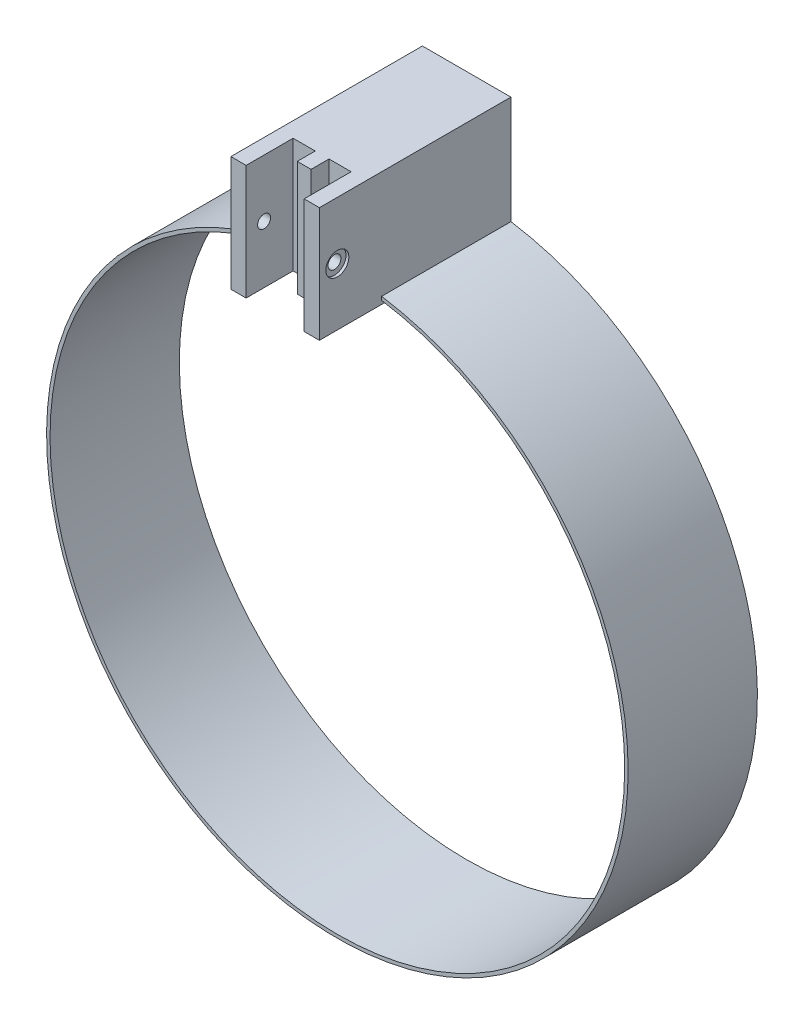
ISO-10303-21;
HEADER;
FILE_DESCRIPTION(('STEP AP214'),'2;1');
FILE_NAME('part.step','',(''),(''),'','','');
FILE_SCHEMA(('AUTOMOTIVE_DESIGN { 1 0 10303 214 1 1 1 1 }'));
ENDSEC;
DATA;
#1=APPLICATION_CONTEXT('core data for automotive mechanical design processes');
#2=APPLICATION_PROTOCOL_DEFINITION('international standard','automotive_design',2000,#1);
#3=PRODUCT_CONTEXT('',#1,'mechanical');
#4=PRODUCT('Part','Part','',(#3));
#5=PRODUCT_RELATED_PRODUCT_CATEGORY('part','',(#4));
#6=PRODUCT_DEFINITION_FORMATION('','',#4);
#7=PRODUCT_DEFINITION_CONTEXT('part definition',#1,'design');
#8=PRODUCT_DEFINITION('design','',#6,#7);
#9=PRODUCT_DEFINITION_SHAPE('','',#8);
#10=(LENGTH_UNIT() NAMED_UNIT(*) SI_UNIT(.MILLI.,.METRE.));
#11=(NAMED_UNIT(*) PLANE_ANGLE_UNIT() SI_UNIT($,.RADIAN.));
#12=(NAMED_UNIT(*) SI_UNIT($,.STERADIAN.) SOLID_ANGLE_UNIT());
#13=UNCERTAINTY_MEASURE_WITH_UNIT(LENGTH_MEASURE(1.E-05),#10,'distance_accuracy_value','');
#14=(GEOMETRIC_REPRESENTATION_CONTEXT(3) GLOBAL_UNCERTAINTY_ASSIGNED_CONTEXT((#13)) GLOBAL_UNIT_ASSIGNED_CONTEXT((#10,
#11,#12)) REPRESENTATION_CONTEXT('',''));
#15=CARTESIAN_POINT('',(0.,0.,0.));
#16=DIRECTION('',(0.,0.,1.));
#17=DIRECTION('',(1.,0.,0.));
#18=AXIS2_PLACEMENT_3D('',#15,#16,#17);
#19=CARTESIAN_POINT('',(-15.4,20.,-15.4));
#20=DIRECTION('',(1.,0.,0.));
#21=DIRECTION('',(0.,0.,-1.));
#22=AXIS2_PLACEMENT_3D('',#19,#20,#21);
#23=PLANE('',#22);
#24=DIRECTION('',(0.,0.,1.));
#25=VECTOR('',#24,1.);
#26=CARTESIAN_POINT('',(-15.4,-20.,-15.4));
#27=LINE('',#26,#25);
#28=CARTESIAN_POINT('',(-15.4,-20.,-60.4));
#29=VERTEX_POINT('',#28);
#30=CARTESIAN_POINT('',(-15.4,-20.,6.25));
#31=VERTEX_POINT('',#30);
#32=EDGE_CURVE('E252',#29,#31,#27,.T.);
#33=ORIENTED_EDGE('',*,*,#32,.T.);
#34=DIRECTION('',(0.,-1.,0.));
#35=VECTOR('',#34,1.);
#36=CARTESIAN_POINT('',(-15.4,20.,6.25));
#37=LINE('',#36,#35);
#38=CARTESIAN_POINT('',(-15.4,20.,6.25));
#39=VERTEX_POINT('',#38);
#40=EDGE_CURVE('E158',#39,#31,#37,.T.);
#41=ORIENTED_EDGE('',*,*,#40,.F.);
#42=DIRECTION('',(0.,0.,1.));
#43=VECTOR('',#42,1.);
#44=CARTESIAN_POINT('',(-15.4,20.,-15.4));
#45=LINE('',#44,#43);
#46=CARTESIAN_POINT('',(-15.4,20.,-60.4));
#47=VERTEX_POINT('',#46);
#48=EDGE_CURVE('E152',#47,#39,#45,.T.);
#49=ORIENTED_EDGE('',*,*,#48,.F.);
#50=DIRECTION('',(0.,-1.,0.));
#51=VECTOR('',#50,1.);
#52=CARTESIAN_POINT('',(-15.4,20.,-60.4));
#53=LINE('',#52,#51);
#54=CARTESIAN_POINT('',(-15.4,-17.5451029129531,-60.4));
#55=VERTEX_POINT('',#54);
#56=EDGE_CURVE('E155',#47,#55,#53,.T.);
#57=ORIENTED_EDGE('',*,*,#56,.T.);
#58=DIRECTION('',(0.,0.,1.));
#59=VECTOR('',#58,1.);
#60=CARTESIAN_POINT('',(-15.4,-17.5451029129531,-60.4));
#61=LINE('',#60,#59);
#62=CARTESIAN_POINT('',(-15.4,-17.5451029129531,-15.4));
#63=VERTEX_POINT('',#62);
#64=EDGE_CURVE('E185',#63,#55,#61,.F.);
#65=ORIENTED_EDGE('',*,*,#64,.F.);
#66=DIRECTION('',(0.,-1.,0.));
#67=VECTOR('',#66,1.);
#68=CARTESIAN_POINT('',(-15.4,20.,-15.4));
#69=LINE('',#68,#67);
#70=CARTESIAN_POINT('',(-15.4,-18.7594158574178,-15.4));
#71=VERTEX_POINT('',#70);
#72=EDGE_CURVE('E260',#63,#71,#69,.T.);
#73=ORIENTED_EDGE('',*,*,#72,.T.);
#74=DIRECTION('',(0.,0.,1.));
#75=VECTOR('',#74,1.);
#76=CARTESIAN_POINT('',(-15.4,-18.7594158574178,-60.4));
#77=LINE('',#76,#75);
#78=CARTESIAN_POINT('',(-15.4,-18.7594158574178,-60.4));
#79=VERTEX_POINT('',#78);
#80=EDGE_CURVE('E12',#71,#79,#77,.F.);
#81=ORIENTED_EDGE('',*,*,#80,.T.);
#82=EDGE_CURVE('E172',#79,#29,#53,.T.);
#83=ORIENTED_EDGE('',*,*,#82,.T.);
#84=EDGE_LOOP('',(#33,#41,#49,#57,#65,#73,#81,#83));
#85=FACE_BOUND('',#84,.T.);
#86=CARTESIAN_POINT('',(-15.4,0.,0.));
#87=DIRECTION('',(-1.,0.,0.));
#88=DIRECTION('',(0.,0.,1.));
#89=AXIS2_PLACEMENT_3D('',#86,#87,#88);
#90=CIRCLE('',#89,3.99999999999999);
#91=CARTESIAN_POINT('',(-15.4,0.,3.99999999999999));
#92=VERTEX_POINT('',#91);
#93=EDGE_CURVE('E196',#92,#92,#90,.T.);
#94=ORIENTED_EDGE('',*,*,#93,.F.);
#95=EDGE_LOOP('',(#94));
#96=FACE_BOUND('',#95,.T.);
#97=ADVANCED_FACE('F39',(#85,#96),#23,.F.);
#98=CARTESIAN_POINT('',(15.4,20.,-15.4));
#99=DIRECTION('',(-1.,0.,0.));
#100=DIRECTION('',(0.,0.,1.));
#101=AXIS2_PLACEMENT_3D('',#98,#99,#100);
#102=PLANE('',#101);
#103=DIRECTION('',(0.,0.,-1.));
#104=VECTOR('',#103,1.);
#105=CARTESIAN_POINT('',(15.4,-20.,-15.4));
#106=LINE('',#105,#104);
#107=CARTESIAN_POINT('',(15.4,-20.,6.25));
#108=VERTEX_POINT('',#107);
#109=CARTESIAN_POINT('',(15.4,-20.,-60.4));
#110=VERTEX_POINT('',#109);
#111=EDGE_CURVE('E250',#108,#110,#106,.T.);
#112=ORIENTED_EDGE('',*,*,#111,.T.);
#113=DIRECTION('',(0.,-1.,0.));
#114=VECTOR('',#113,1.);
#115=CARTESIAN_POINT('',(15.4,20.,-60.4));
#116=LINE('',#115,#114);
#117=CARTESIAN_POINT('',(15.4,-18.7594158574178,-60.4));
#118=VERTEX_POINT('',#117);
#119=EDGE_CURVE('E171',#118,#110,#116,.T.);
#120=ORIENTED_EDGE('',*,*,#119,.F.);
#121=DIRECTION('',(0.,0.,1.));
#122=VECTOR('',#121,1.);
#123=CARTESIAN_POINT('',(15.4,-18.7594158574178,-60.4));
#124=LINE('',#123,#122);
#125=CARTESIAN_POINT('',(15.4,-18.7594158574178,-15.4));
#126=VERTEX_POINT('',#125);
#127=EDGE_CURVE('E47',#118,#126,#124,.T.);
#128=ORIENTED_EDGE('',*,*,#127,.T.);
#129=DIRECTION('',(0.,-1.,0.));
#130=VECTOR('',#129,1.);
#131=CARTESIAN_POINT('',(15.4,20.,-15.4));
#132=LINE('',#131,#130);
#133=CARTESIAN_POINT('',(15.4,-17.5451029129531,-15.4));
#134=VERTEX_POINT('',#133);
#135=EDGE_CURVE('E263',#134,#126,#132,.T.);
#136=ORIENTED_EDGE('',*,*,#135,.F.);
#137=DIRECTION('',(0.,0.,1.));
#138=VECTOR('',#137,1.);
#139=CARTESIAN_POINT('',(15.4,-17.5451029129531,-60.4));
#140=LINE('',#139,#138);
#141=CARTESIAN_POINT('',(15.4,-17.5451029129531,-60.4));
#142=VERTEX_POINT('',#141);
#143=EDGE_CURVE('E182',#142,#134,#140,.T.);
#144=ORIENTED_EDGE('',*,*,#143,.F.);
#145=CARTESIAN_POINT('',(15.4,20.,-60.4));
#146=VERTEX_POINT('',#145);
#147=EDGE_CURVE('E54',#146,#142,#116,.T.);
#148=ORIENTED_EDGE('',*,*,#147,.F.);
#149=DIRECTION('',(0.,0.,-1.));
#150=VECTOR('',#149,1.);
#151=CARTESIAN_POINT('',(15.4,20.,-15.4));
#152=LINE('',#151,#150);
#153=CARTESIAN_POINT('',(15.4,20.,6.25));
#154=VERTEX_POINT('',#153);
#155=EDGE_CURVE('E164',#154,#146,#152,.T.);
#156=ORIENTED_EDGE('',*,*,#155,.F.);
#157=DIRECTION('',(0.,-1.,0.));
#158=VECTOR('',#157,1.);
#159=CARTESIAN_POINT('',(15.4,20.,6.25));
#160=LINE('',#159,#158);
#161=EDGE_CURVE('E266',#154,#108,#160,.T.);
#162=ORIENTED_EDGE('',*,*,#161,.T.);
#163=EDGE_LOOP('',(#112,#120,#128,#136,#144,#148,#156,#162));
#164=FACE_BOUND('',#163,.T.);
#165=CARTESIAN_POINT('',(15.4,0.,0.));
#166=DIRECTION('',(1.,0.,0.));
#167=DIRECTION('',(0.,0.,-1.));
#168=AXIS2_PLACEMENT_3D('',#165,#166,#167);
#169=CIRCLE('',#168,3.99999999999999);
#170=CARTESIAN_POINT('',(15.4,0.,-3.99999999999999));
#171=VERTEX_POINT('',#170);
#172=EDGE_CURVE('E206',#171,#171,#169,.T.);
#173=ORIENTED_EDGE('',*,*,#172,.F.);
#174=EDGE_LOOP('',(#173));
#175=FACE_BOUND('',#174,.T.);
#176=ADVANCED_FACE('F297',(#164,#175),#102,.F.);
#177=CARTESIAN_POINT('',(-10.1,20.,-10.1));
#178=DIRECTION('',(0.,0.,-1.));
#179=DIRECTION('',(-1.,0.,0.));
#180=AXIS2_PLACEMENT_3D('',#177,#178,#179);
#181=PLANE('',#180);
#182=DIRECTION('',(1.,0.,0.));
#183=VECTOR('',#182,1.);
#184=CARTESIAN_POINT('',(-10.1,-20.,-10.1));
#185=LINE('',#184,#183);
#186=CARTESIAN_POINT('',(-10.1,-20.,-10.1));
#187=VERTEX_POINT('',#186);
#188=CARTESIAN_POINT('',(-2.4,-20.,-10.1));
#189=VERTEX_POINT('',#188);
#190=EDGE_CURVE('E215',#187,#189,#185,.T.);
#191=ORIENTED_EDGE('',*,*,#190,.T.);
#192=DIRECTION('',(0.,-1.,0.));
#193=VECTOR('',#192,1.);
#194=CARTESIAN_POINT('',(-2.4,20.,-10.1));
#195=LINE('',#194,#193);
#196=CARTESIAN_POINT('',(-2.4,20.,-10.1));
#197=VERTEX_POINT('',#196);
#198=EDGE_CURVE('E284',#197,#189,#195,.T.);
#199=ORIENTED_EDGE('',*,*,#198,.F.);
#200=DIRECTION('',(1.,0.,0.));
#201=VECTOR('',#200,1.);
#202=CARTESIAN_POINT('',(-10.1,20.,-10.1));
#203=LINE('',#202,#201);
#204=CARTESIAN_POINT('',(-10.1,20.,-10.1));
#205=VERTEX_POINT('',#204);
#206=EDGE_CURVE('E218',#205,#197,#203,.T.);
#207=ORIENTED_EDGE('',*,*,#206,.F.);
#208=DIRECTION('',(0.,-1.,0.));
#209=VECTOR('',#208,1.);
#210=CARTESIAN_POINT('',(-10.1,20.,-10.1));
#211=LINE('',#210,#209);
#212=EDGE_CURVE('E287',#205,#187,#211,.T.);
#213=ORIENTED_EDGE('',*,*,#212,.T.);
#214=EDGE_LOOP('',(#191,#199,#207,#213));
#215=FACE_BOUND('',#214,.T.);
#216=ADVANCED_FACE('F41',(#215),#181,.F.);
#217=CARTESIAN_POINT('',(-2.4,20.,-10.1));
#218=DIRECTION('',(1.,0.,0.));
#219=DIRECTION('',(0.,0.,-1.));
#220=AXIS2_PLACEMENT_3D('',#217,#218,#219);
#221=PLANE('',#220);
#222=DIRECTION('',(0.,0.,1.));
#223=VECTOR('',#222,1.);
#224=CARTESIAN_POINT('',(-2.4,-20.,-10.1));
#225=LINE('',#224,#223);
#226=CARTESIAN_POINT('',(-2.4,-20.,-3.85));
#227=VERTEX_POINT('',#226);
#228=EDGE_CURVE('E237',#189,#227,#225,.T.);
#229=ORIENTED_EDGE('',*,*,#228,.T.);
#230=DIRECTION('',(0.,-1.,0.));
#231=VECTOR('',#230,1.);
#232=CARTESIAN_POINT('',(-2.4,20.,-3.85));
#233=LINE('',#232,#231);
#234=CARTESIAN_POINT('',(-2.4,20.,-3.85));
#235=VERTEX_POINT('',#234);
#236=EDGE_CURVE('E281',#235,#227,#233,.T.);
#237=ORIENTED_EDGE('',*,*,#236,.F.);
#238=DIRECTION('',(0.,0.,1.));
#239=VECTOR('',#238,1.);
#240=CARTESIAN_POINT('',(-2.4,20.,-10.1));
#241=LINE('',#240,#239);
#242=EDGE_CURVE('E221',#197,#235,#241,.T.);
#243=ORIENTED_EDGE('',*,*,#242,.F.);
#244=ORIENTED_EDGE('',*,*,#198,.T.);
#245=EDGE_LOOP('',(#229,#237,#243,#244));
#246=FACE_BOUND('',#245,.T.);
#247=ADVANCED_FACE('F335',(#246),#221,.F.);
#248=CARTESIAN_POINT('',(-2.4,20.,-3.85));
#249=DIRECTION('',(0.,0.,-1.));
#250=DIRECTION('',(-1.,0.,0.));
#251=AXIS2_PLACEMENT_3D('',#248,#249,#250);
#252=PLANE('',#251);
#253=DIRECTION('',(1.,0.,0.));
#254=VECTOR('',#253,1.);
#255=CARTESIAN_POINT('',(-2.4,-20.,-3.85));
#256=LINE('',#255,#254);
#257=CARTESIAN_POINT('',(2.4,-20.,-3.85));
#258=VERTEX_POINT('',#257);
#259=EDGE_CURVE('E239',#227,#258,#256,.T.);
#260=ORIENTED_EDGE('',*,*,#259,.T.);
#261=DIRECTION('',(0.,-1.,0.));
#262=VECTOR('',#261,1.);
#263=CARTESIAN_POINT('',(2.4,20.,-3.85));
#264=LINE('',#263,#262);
#265=CARTESIAN_POINT('',(2.4,20.,-3.85));
#266=VERTEX_POINT('',#265);
#267=EDGE_CURVE('E278',#266,#258,#264,.T.);
#268=ORIENTED_EDGE('',*,*,#267,.F.);
#269=DIRECTION('',(1.,0.,0.));
#270=VECTOR('',#269,1.);
#271=CARTESIAN_POINT('',(-2.4,20.,-3.85));
#272=LINE('',#271,#270);
#273=EDGE_CURVE('E223',#235,#266,#272,.T.);
#274=ORIENTED_EDGE('',*,*,#273,.F.);
#275=ORIENTED_EDGE('',*,*,#236,.T.);
#276=EDGE_LOOP('',(#260,#268,#274,#275));
#277=FACE_BOUND('',#276,.T.);
#278=ADVANCED_FACE('F338',(#277),#252,.F.);
#279=CARTESIAN_POINT('',(2.4,20.,-10.1));
#280=DIRECTION('',(-1.,0.,0.));
#281=DIRECTION('',(0.,0.,1.));
#282=AXIS2_PLACEMENT_3D('',#279,#280,#281);
#283=PLANE('',#282);
#284=DIRECTION('',(0.,0.,-1.));
#285=VECTOR('',#284,1.);
#286=CARTESIAN_POINT('',(2.4,-20.,-10.1));
#287=LINE('',#286,#285);
#288=CARTESIAN_POINT('',(2.4,-20.,-10.1));
#289=VERTEX_POINT('',#288);
#290=EDGE_CURVE('E241',#258,#289,#287,.T.);
#291=ORIENTED_EDGE('',*,*,#290,.T.);
#292=DIRECTION('',(0.,-1.,0.));
#293=VECTOR('',#292,1.);
#294=CARTESIAN_POINT('',(2.4,20.,-10.1));
#295=LINE('',#294,#293);
#296=CARTESIAN_POINT('',(2.4,20.,-10.1));
#297=VERTEX_POINT('',#296);
#298=EDGE_CURVE('E275',#297,#289,#295,.T.);
#299=ORIENTED_EDGE('',*,*,#298,.F.);
#300=DIRECTION('',(0.,0.,-1.));
#301=VECTOR('',#300,1.);
#302=CARTESIAN_POINT('',(2.4,20.,-10.1));
#303=LINE('',#302,#301);
#304=EDGE_CURVE('E225',#266,#297,#303,.T.);
#305=ORIENTED_EDGE('',*,*,#304,.F.);
#306=ORIENTED_EDGE('',*,*,#267,.T.);
#307=EDGE_LOOP('',(#291,#299,#305,#306));
#308=FACE_BOUND('',#307,.T.);
#309=ADVANCED_FACE('F343',(#308),#283,.F.);
#310=CARTESIAN_POINT('',(10.1,20.,-10.1));
#311=DIRECTION('',(0.,0.,-1.));
#312=DIRECTION('',(-1.,0.,0.));
#313=AXIS2_PLACEMENT_3D('',#310,#311,#312);
#314=PLANE('',#313);
#315=DIRECTION('',(1.,0.,0.));
#316=VECTOR('',#315,1.);
#317=CARTESIAN_POINT('',(10.1,-20.,-10.1));
#318=LINE('',#317,#316);
#319=CARTESIAN_POINT('',(10.1,-20.,-10.1));
#320=VERTEX_POINT('',#319);
#321=EDGE_CURVE('E243',#289,#320,#318,.T.);
#322=ORIENTED_EDGE('',*,*,#321,.T.);
#323=DIRECTION('',(0.,-1.,0.));
#324=VECTOR('',#323,1.);
#325=CARTESIAN_POINT('',(10.1,20.,-10.1));
#326=LINE('',#325,#324);
#327=CARTESIAN_POINT('',(10.1,20.,-10.1));
#328=VERTEX_POINT('',#327);
#329=EDGE_CURVE('E272',#328,#320,#326,.T.);
#330=ORIENTED_EDGE('',*,*,#329,.F.);
#331=DIRECTION('',(1.,0.,0.));
#332=VECTOR('',#331,1.);
#333=CARTESIAN_POINT('',(10.1,20.,-10.1));
#334=LINE('',#333,#332);
#335=EDGE_CURVE('E227',#297,#328,#334,.T.);
#336=ORIENTED_EDGE('',*,*,#335,.F.);
#337=ORIENTED_EDGE('',*,*,#298,.T.);
#338=EDGE_LOOP('',(#322,#330,#336,#337));
#339=FACE_BOUND('',#338,.T.);
#340=ADVANCED_FACE('F349',(#339),#314,.F.);
#341=CARTESIAN_POINT('',(10.1,20.,2.4));
#342=DIRECTION('',(1.,0.,0.));
#343=DIRECTION('',(0.,0.,-1.));
#344=AXIS2_PLACEMENT_3D('',#341,#342,#343);
#345=PLANE('',#344);
#346=DIRECTION('',(0.,-1.,0.));
#347=VECTOR('',#346,1.);
#348=CARTESIAN_POINT('',(10.1,20.,6.25));
#349=LINE('',#348,#347);
#350=CARTESIAN_POINT('',(10.1,20.,6.25));
#351=VERTEX_POINT('',#350);
#352=CARTESIAN_POINT('',(10.1,-20.,6.25));
#353=VERTEX_POINT('',#352);
#354=EDGE_CURVE('E269',#351,#353,#349,.T.);
#355=ORIENTED_EDGE('',*,*,#354,.F.);
#356=DIRECTION('',(0.,0.,1.));
#357=VECTOR('',#356,1.);
#358=CARTESIAN_POINT('',(10.1,20.,-2.4));
#359=LINE('',#358,#357);
#360=EDGE_CURVE('E229',#328,#351,#359,.T.);
#361=ORIENTED_EDGE('',*,*,#360,.F.);
#362=ORIENTED_EDGE('',*,*,#329,.T.);
#363=DIRECTION('',(0.,0.,1.));
#364=VECTOR('',#363,1.);
#365=CARTESIAN_POINT('',(10.1,-20.,2.4));
#366=LINE('',#365,#364);
#367=EDGE_CURVE('E246',#320,#353,#366,.T.);
#368=ORIENTED_EDGE('',*,*,#367,.T.);
#369=EDGE_LOOP('',(#355,#361,#362,#368));
#370=FACE_BOUND('',#369,.T.);
#371=CARTESIAN_POINT('',(10.1,0.,0.));
#372=DIRECTION('',(1.,0.,0.));
#373=DIRECTION('',(0.,0.,-1.));
#374=AXIS2_PLACEMENT_3D('',#371,#372,#373);
#375=CIRCLE('',#374,2.25000000000001);
#376=CARTESIAN_POINT('',(10.1,0.,-2.25000000000001));
#377=VERTEX_POINT('',#376);
#378=EDGE_CURVE('E200',#377,#377,#375,.F.);
#379=ORIENTED_EDGE('',*,*,#378,.F.);
#380=EDGE_LOOP('',(#379));
#381=FACE_BOUND('',#380,.T.);
#382=ADVANCED_FACE('F352',(#370,#381),#345,.F.);
#383=CARTESIAN_POINT('',(10.1,20.,6.25));
#384=DIRECTION('',(0.,0.,-1.));
#385=DIRECTION('',(-1.,0.,0.));
#386=AXIS2_PLACEMENT_3D('',#383,#384,#385);
#387=PLANE('',#386);
#388=DIRECTION('',(1.,0.,0.));
#389=VECTOR('',#388,1.);
#390=CARTESIAN_POINT('',(10.1,-20.,6.25));
#391=LINE('',#390,#389);
#392=EDGE_CURVE('E248',#353,#108,#391,.T.);
#393=ORIENTED_EDGE('',*,*,#392,.T.);
#394=ORIENTED_EDGE('',*,*,#161,.F.);
#395=DIRECTION('',(1.,0.,0.));
#396=VECTOR('',#395,1.);
#397=CARTESIAN_POINT('',(10.1,20.,6.25));
#398=LINE('',#397,#396);
#399=EDGE_CURVE('E231',#351,#154,#398,.T.);
#400=ORIENTED_EDGE('',*,*,#399,.F.);
#401=ORIENTED_EDGE('',*,*,#354,.T.);
#402=EDGE_LOOP('',(#393,#394,#400,#401));
#403=FACE_BOUND('',#402,.T.);
#404=ADVANCED_FACE('F354',(#403),#387,.F.);
#405=CARTESIAN_POINT('',(-10.1,20.,6.25));
#406=DIRECTION('',(0.,0.,-1.));
#407=DIRECTION('',(-1.,0.,0.));
#408=AXIS2_PLACEMENT_3D('',#405,#406,#407);
#409=PLANE('',#408);
#410=DIRECTION('',(1.,0.,0.));
#411=VECTOR('',#410,1.);
#412=CARTESIAN_POINT('',(-10.1,-20.,6.25));
#413=LINE('',#412,#411);
#414=CARTESIAN_POINT('',(-10.1,-20.,6.25));
#415=VERTEX_POINT('',#414);
#416=EDGE_CURVE('E254',#31,#415,#413,.T.);
#417=ORIENTED_EDGE('',*,*,#416,.T.);
#418=DIRECTION('',(0.,-1.,0.));
#419=VECTOR('',#418,1.);
#420=CARTESIAN_POINT('',(-10.1,20.,6.25));
#421=LINE('',#420,#419);
#422=CARTESIAN_POINT('',(-10.1,20.,6.25));
#423=VERTEX_POINT('',#422);
#424=EDGE_CURVE('E235',#423,#415,#421,.T.);
#425=ORIENTED_EDGE('',*,*,#424,.F.);
#426=DIRECTION('',(1.,0.,0.));
#427=VECTOR('',#426,1.);
#428=CARTESIAN_POINT('',(-10.1,20.,6.25));
#429=LINE('',#428,#427);
#430=EDGE_CURVE('E163',#39,#423,#429,.T.);
#431=ORIENTED_EDGE('',*,*,#430,.F.);
#432=ORIENTED_EDGE('',*,*,#40,.T.);
#433=EDGE_LOOP('',(#417,#425,#431,#432));
#434=FACE_BOUND('',#433,.T.);
#435=ADVANCED_FACE('F318',(#434),#409,.F.);
#436=CARTESIAN_POINT('',(-10.1,20.,2.4));
#437=DIRECTION('',(-1.,0.,0.));
#438=DIRECTION('',(0.,0.,1.));
#439=AXIS2_PLACEMENT_3D('',#436,#437,#438);
#440=PLANE('',#439);
#441=DIRECTION('',(0.,0.,-1.));
#442=VECTOR('',#441,1.);
#443=CARTESIAN_POINT('',(-10.1,-20.,2.4));
#444=LINE('',#443,#442);
#445=EDGE_CURVE('E219',#415,#187,#444,.T.);
#446=ORIENTED_EDGE('',*,*,#445,.T.);
#447=ORIENTED_EDGE('',*,*,#212,.F.);
#448=DIRECTION('',(0.,0.,-1.));
#449=VECTOR('',#448,1.);
#450=CARTESIAN_POINT('',(-10.1,20.,-2.4));
#451=LINE('',#450,#449);
#452=EDGE_CURVE('E216',#423,#205,#451,.T.);
#453=ORIENTED_EDGE('',*,*,#452,.F.);
#454=ORIENTED_EDGE('',*,*,#424,.T.);
#455=EDGE_LOOP('',(#446,#447,#453,#454));
#456=FACE_BOUND('',#455,.T.);
#457=CARTESIAN_POINT('',(-10.1,0.,0.));
#458=DIRECTION('',(-1.,0.,0.));
#459=DIRECTION('',(0.,0.,1.));
#460=AXIS2_PLACEMENT_3D('',#457,#458,#459);
#461=CIRCLE('',#460,2.25000000000001);
#462=CARTESIAN_POINT('',(-10.1,0.,2.25000000000001));
#463=VERTEX_POINT('',#462);
#464=EDGE_CURVE('E193',#463,#463,#461,.F.);
#465=ORIENTED_EDGE('',*,*,#464,.F.);
#466=EDGE_LOOP('',(#465));
#467=FACE_BOUND('',#466,.T.);
#468=ADVANCED_FACE('F325',(#456,#467),#440,.F.);
#469=CARTESIAN_POINT('',(0.,20.,0.));
#470=DIRECTION('',(0.,1.,0.));
#471=DIRECTION('',(0.,0.,1.));
#472=AXIS2_PLACEMENT_3D('',#469,#470,#471);
#473=PLANE('',#472);
#474=ORIENTED_EDGE('',*,*,#360,.T.);
#475=ORIENTED_EDGE('',*,*,#399,.T.);
#476=ORIENTED_EDGE('',*,*,#155,.T.);
#477=DIRECTION('',(1.,0.,0.));
#478=VECTOR('',#477,1.);
#479=CARTESIAN_POINT('',(-15.4,20.,-60.4));
#480=LINE('',#479,#478);
#481=EDGE_CURVE('E168',#47,#146,#480,.T.);
#482=ORIENTED_EDGE('',*,*,#481,.F.);
#483=ORIENTED_EDGE('',*,*,#48,.T.);
#484=ORIENTED_EDGE('',*,*,#430,.T.);
#485=ORIENTED_EDGE('',*,*,#452,.T.);
#486=ORIENTED_EDGE('',*,*,#206,.T.);
#487=ORIENTED_EDGE('',*,*,#242,.T.);
#488=ORIENTED_EDGE('',*,*,#273,.T.);
#489=ORIENTED_EDGE('',*,*,#304,.T.);
#490=ORIENTED_EDGE('',*,*,#335,.T.);
#491=EDGE_LOOP('',(#474,#475,#476,#482,#483,#484,#485,#486,#487,#488,#489,#490));
#492=FACE_BOUND('',#491,.T.);
#493=ADVANCED_FACE('F174',(#492),#473,.T.);
#494=CARTESIAN_POINT('',(0.,-20.,0.));
#495=DIRECTION('',(0.,1.,0.));
#496=DIRECTION('',(0.,0.,1.));
#497=AXIS2_PLACEMENT_3D('',#494,#495,#496);
#498=PLANE('',#497);
#499=ORIENTED_EDGE('',*,*,#367,.F.);
#500=ORIENTED_EDGE('',*,*,#321,.F.);
#501=ORIENTED_EDGE('',*,*,#290,.F.);
#502=ORIENTED_EDGE('',*,*,#259,.F.);
#503=ORIENTED_EDGE('',*,*,#228,.F.);
#504=ORIENTED_EDGE('',*,*,#190,.F.);
#505=ORIENTED_EDGE('',*,*,#445,.F.);
#506=ORIENTED_EDGE('',*,*,#416,.F.);
#507=ORIENTED_EDGE('',*,*,#32,.F.);
#508=DIRECTION('',(1.,0.,0.));
#509=VECTOR('',#508,1.);
#510=CARTESIAN_POINT('',(-15.4,-20.,-60.4));
#511=LINE('',#510,#509);
#512=EDGE_CURVE('E176',#29,#110,#511,.T.);
#513=ORIENTED_EDGE('',*,*,#512,.T.);
#514=ORIENTED_EDGE('',*,*,#111,.F.);
#515=ORIENTED_EDGE('',*,*,#392,.F.);
#516=EDGE_LOOP('',(#499,#500,#501,#502,#503,#504,#505,#506,#507,#513,#514,#515));
#517=FACE_BOUND('',#516,.T.);
#518=ADVANCED_FACE('F313',(#517),#498,.F.);
#519=CARTESIAN_POINT('',(15.4,0.,0.));
#520=DIRECTION('',(1.,0.,0.));
#521=DIRECTION('',(0.,0.,-1.));
#522=AXIS2_PLACEMENT_3D('',#519,#520,#521);
#523=CYLINDRICAL_SURFACE('',#522,2.25000000000001);
#524=ORIENTED_EDGE('',*,*,#378,.T.);
#525=EDGE_LOOP('',(#524));
#526=FACE_BOUND('',#525,.T.);
#527=CARTESIAN_POINT('',(14.4,0.,0.));
#528=DIRECTION('',(1.,0.,0.));
#529=DIRECTION('',(0.,0.,-1.));
#530=AXIS2_PLACEMENT_3D('',#527,#528,#529);
#531=CIRCLE('',#530,2.25000000000002);
#532=CARTESIAN_POINT('',(14.4,0.,-2.25000000000002));
#533=VERTEX_POINT('',#532);
#534=EDGE_CURVE('E212',#533,#533,#531,.T.);
#535=ORIENTED_EDGE('',*,*,#534,.T.);
#536=EDGE_LOOP('',(#535));
#537=FACE_BOUND('',#536,.T.);
#538=ADVANCED_FACE('F374',(#526,#537),#523,.F.);
#539=CARTESIAN_POINT('',(14.4,2.25000000000002,0.));
#540=DIRECTION('',(-1.,0.,0.));
#541=DIRECTION('',(0.,0.,1.));
#542=AXIS2_PLACEMENT_3D('',#539,#540,#541);
#543=PLANE('',#542);
#544=ORIENTED_EDGE('',*,*,#534,.F.);
#545=EDGE_LOOP('',(#544));
#546=FACE_BOUND('',#545,.T.);
#547=CARTESIAN_POINT('',(14.4,0.,0.));
#548=DIRECTION('',(1.,0.,0.));
#549=DIRECTION('',(0.,0.,-1.));
#550=AXIS2_PLACEMENT_3D('',#547,#548,#549);
#551=CIRCLE('',#550,4.);
#552=CARTESIAN_POINT('',(14.4,0.,-4.));
#553=VERTEX_POINT('',#552);
#554=EDGE_CURVE('E209',#553,#553,#551,.T.);
#555=ORIENTED_EDGE('',*,*,#554,.T.);
#556=EDGE_LOOP('',(#555));
#557=FACE_BOUND('',#556,.T.);
#558=ADVANCED_FACE('F379',(#546,#557),#543,.F.);
#559=CARTESIAN_POINT('',(15.4,0.,0.));
#560=DIRECTION('',(1.,0.,0.));
#561=DIRECTION('',(0.,0.,-1.));
#562=AXIS2_PLACEMENT_3D('',#559,#560,#561);
#563=CYLINDRICAL_SURFACE('',#562,3.99999999999999);
#564=ORIENTED_EDGE('',*,*,#554,.F.);
#565=EDGE_LOOP('',(#564));
#566=FACE_BOUND('',#565,.T.);
#567=ORIENTED_EDGE('',*,*,#172,.T.);
#568=EDGE_LOOP('',(#567));
#569=FACE_BOUND('',#568,.T.);
#570=ADVANCED_FACE('F383',(#566,#569),#563,.F.);
#571=CARTESIAN_POINT('',(-15.4,0.,0.));
#572=DIRECTION('',(-1.,0.,0.));
#573=DIRECTION('',(0.,0.,1.));
#574=AXIS2_PLACEMENT_3D('',#571,#572,#573);
#575=CYLINDRICAL_SURFACE('',#574,2.25000000000001);
#576=ORIENTED_EDGE('',*,*,#464,.T.);
#577=EDGE_LOOP('',(#576));
#578=FACE_BOUND('',#577,.T.);
#579=CARTESIAN_POINT('',(-14.4,0.,0.));
#580=DIRECTION('',(-1.,0.,0.));
#581=DIRECTION('',(0.,0.,1.));
#582=AXIS2_PLACEMENT_3D('',#579,#580,#581);
#583=CIRCLE('',#582,2.25000000000002);
#584=CARTESIAN_POINT('',(-14.4,0.,2.25000000000002));
#585=VERTEX_POINT('',#584);
#586=EDGE_CURVE('E203',#585,#585,#583,.T.);
#587=ORIENTED_EDGE('',*,*,#586,.T.);
#588=EDGE_LOOP('',(#587));
#589=FACE_BOUND('',#588,.T.);
#590=ADVANCED_FACE('F387',(#578,#589),#575,.F.);
#591=CARTESIAN_POINT('',(-14.4,2.25000000000002,0.));
#592=DIRECTION('',(1.,0.,0.));
#593=DIRECTION('',(0.,0.,-1.));
#594=AXIS2_PLACEMENT_3D('',#591,#592,#593);
#595=PLANE('',#594);
#596=ORIENTED_EDGE('',*,*,#586,.F.);
#597=EDGE_LOOP('',(#596));
#598=FACE_BOUND('',#597,.T.);
#599=CARTESIAN_POINT('',(-14.4,0.,0.));
#600=DIRECTION('',(-1.,0.,0.));
#601=DIRECTION('',(0.,0.,1.));
#602=AXIS2_PLACEMENT_3D('',#599,#600,#601);
#603=CIRCLE('',#602,4.);
#604=CARTESIAN_POINT('',(-14.4,0.,4.));
#605=VERTEX_POINT('',#604);
#606=EDGE_CURVE('E199',#605,#605,#603,.T.);
#607=ORIENTED_EDGE('',*,*,#606,.T.);
#608=EDGE_LOOP('',(#607));
#609=FACE_BOUND('',#608,.T.);
#610=ADVANCED_FACE('F391',(#598,#609),#595,.F.);
#611=CARTESIAN_POINT('',(-15.4,0.,0.));
#612=DIRECTION('',(-1.,0.,0.));
#613=DIRECTION('',(0.,0.,1.));
#614=AXIS2_PLACEMENT_3D('',#611,#612,#613);
#615=CYLINDRICAL_SURFACE('',#614,3.99999999999999);
#616=ORIENTED_EDGE('',*,*,#606,.F.);
#617=EDGE_LOOP('',(#616));
#618=FACE_BOUND('',#617,.T.);
#619=ORIENTED_EDGE('',*,*,#93,.T.);
#620=EDGE_LOOP('',(#619));
#621=FACE_BOUND('',#620,.T.);
#622=ADVANCED_FACE('F395',(#618,#621),#615,.F.);
#623=CARTESIAN_POINT('',(0.,-117.566500623643,-60.4));
#624=DIRECTION('',(0.,0.,-1.));
#625=DIRECTION('',(-1.,0.,0.));
#626=AXIS2_PLACEMENT_3D('',#623,#624,#625);
#627=PLANE('',#626);
#628=CARTESIAN_POINT('',(0.,-117.566500623643,-60.4));
#629=DIRECTION('',(0.,0.,-1.));
#630=DIRECTION('',(-1.,0.,0.));
#631=AXIS2_PLACEMENT_3D('',#628,#629,#630);
#632=CIRCLE('',#631,101.2);
#633=EDGE_CURVE('E170',#142,#55,#632,.T.);
#634=ORIENTED_EDGE('',*,*,#633,.T.);
#635=ORIENTED_EDGE('',*,*,#56,.F.);
#636=ORIENTED_EDGE('',*,*,#481,.T.);
#637=ORIENTED_EDGE('',*,*,#147,.T.);
#638=EDGE_LOOP('',(#634,#635,#636,#637));
#639=FACE_BOUND('',#638,.T.);
#640=ORIENTED_EDGE('',*,*,#82,.F.);
#641=CARTESIAN_POINT('',(0.,-117.566500623643,-60.4));
#642=DIRECTION('',(0.,0.,-1.));
#643=DIRECTION('',(-1.,0.,0.));
#644=AXIS2_PLACEMENT_3D('',#641,#642,#643);
#645=CIRCLE('',#644,100.);
#646=EDGE_CURVE('E62',#118,#79,#645,.T.);
#647=ORIENTED_EDGE('',*,*,#646,.F.);
#648=ORIENTED_EDGE('',*,*,#119,.T.);
#649=ORIENTED_EDGE('',*,*,#512,.F.);
#650=EDGE_LOOP('',(#640,#647,#648,#649));
#651=FACE_BOUND('',#650,.T.);
#652=ADVANCED_FACE('F166',(#639,#651),#627,.T.);
#653=CARTESIAN_POINT('',(0.,-117.566500623643,-15.4));
#654=DIRECTION('',(0.,0.,-1.));
#655=DIRECTION('',(-1.,0.,0.));
#656=AXIS2_PLACEMENT_3D('',#653,#654,#655);
#657=PLANE('',#656);
#658=ORIENTED_EDGE('',*,*,#72,.F.);
#659=CARTESIAN_POINT('',(0.,-117.566500623643,-15.4));
#660=DIRECTION('',(0.,0.,-1.));
#661=DIRECTION('',(-1.,0.,0.));
#662=AXIS2_PLACEMENT_3D('',#659,#660,#661);
#663=CIRCLE('',#662,101.2);
#664=EDGE_CURVE('E189',#134,#63,#663,.T.);
#665=ORIENTED_EDGE('',*,*,#664,.F.);
#666=ORIENTED_EDGE('',*,*,#135,.T.);
#667=CARTESIAN_POINT('',(0.,-117.566500623643,-15.4));
#668=DIRECTION('',(0.,0.,-1.));
#669=DIRECTION('',(-1.,0.,0.));
#670=AXIS2_PLACEMENT_3D('',#667,#668,#669);
#671=CIRCLE('',#670,100.);
#672=EDGE_CURVE('E187',#126,#71,#671,.T.);
#673=ORIENTED_EDGE('',*,*,#672,.T.);
#674=EDGE_LOOP('',(#658,#665,#666,#673));
#675=FACE_BOUND('',#674,.T.);
#676=ADVANCED_FACE('F304',(#675),#657,.F.);
#677=CARTESIAN_POINT('',(0.,-117.566500623643,-60.4));
#678=DIRECTION('',(0.,0.,1.));
#679=DIRECTION('',(1.,0.,0.));
#680=AXIS2_PLACEMENT_3D('',#677,#678,#679);
#681=CYLINDRICAL_SURFACE('',#680,101.2);
#682=ORIENTED_EDGE('',*,*,#664,.T.);
#683=ORIENTED_EDGE('',*,*,#64,.T.);
#684=ORIENTED_EDGE('',*,*,#633,.F.);
#685=ORIENTED_EDGE('',*,*,#143,.T.);
#686=EDGE_LOOP('',(#682,#683,#684,#685));
#687=FACE_BOUND('',#686,.T.);
#688=ADVANCED_FACE('F306',(#687),#681,.T.);
#689=CARTESIAN_POINT('',(0.,-117.566500623643,-60.4));
#690=DIRECTION('',(0.,0.,1.));
#691=DIRECTION('',(1.,0.,0.));
#692=AXIS2_PLACEMENT_3D('',#689,#690,#691);
#693=CYLINDRICAL_SURFACE('',#692,100.);
#694=ORIENTED_EDGE('',*,*,#80,.F.);
#695=ORIENTED_EDGE('',*,*,#672,.F.);
#696=ORIENTED_EDGE('',*,*,#127,.F.);
#697=ORIENTED_EDGE('',*,*,#646,.T.);
#698=EDGE_LOOP('',(#694,#695,#696,#697));
#699=FACE_BOUND('',#698,.T.);
#700=ADVANCED_FACE('F300',(#699),#693,.F.);
#701=CLOSED_SHELL('',(#97,#176,#216,#247,#278,#309,#340,#382,#404,#435,#468,#493,#518,#538,#558,
#570,#590,#610,#622,#652,#676,#688,#700));
#702=MANIFOLD_SOLID_BREP('B2',#701);
#703=ADVANCED_BREP_SHAPE_REPRESENTATION('',(#18,#702),#14);
#704=SHAPE_DEFINITION_REPRESENTATION(#9,#703);
ENDSEC;
END-ISO-10303-21;
